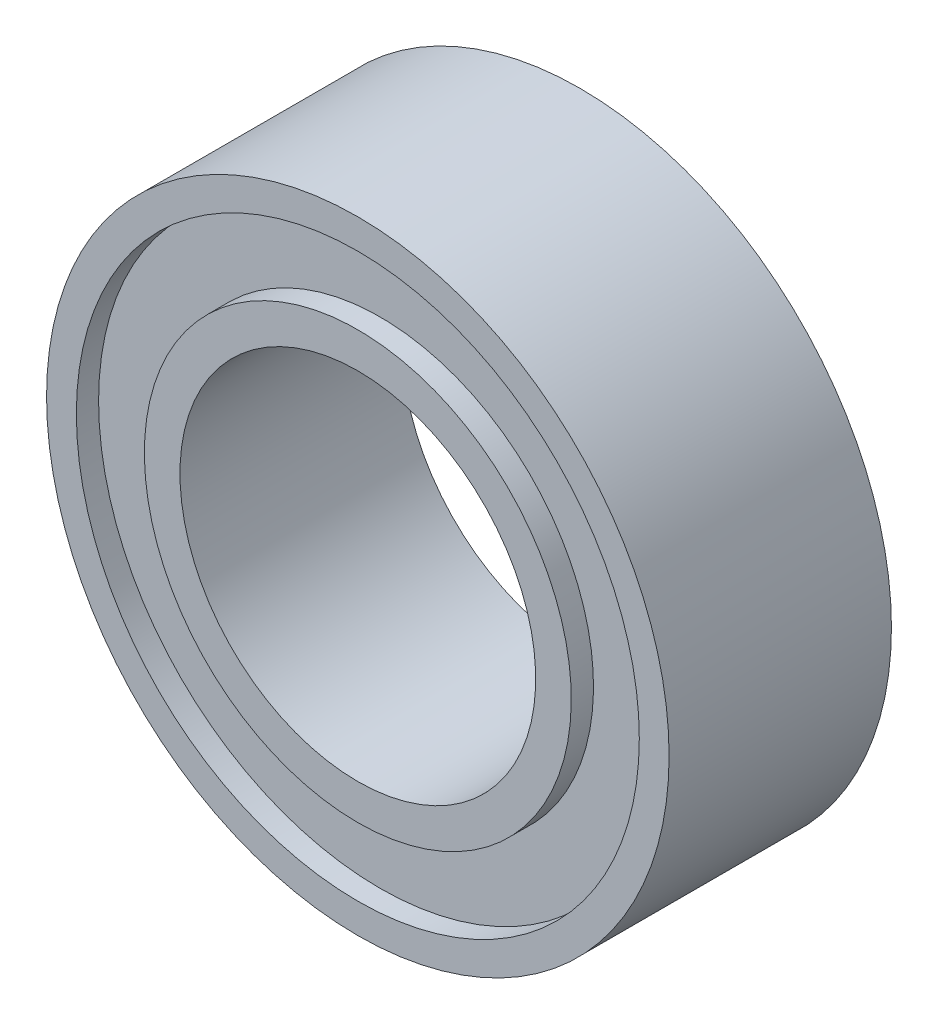
ISO-10303-21;
HEADER;
FILE_DESCRIPTION(('STEP AP214'),'2;1');
FILE_NAME('part.step','',(''),(''),'','','');
FILE_SCHEMA(('AUTOMOTIVE_DESIGN { 1 0 10303 214 1 1 1 1 }'));
ENDSEC;
DATA;
#1=APPLICATION_CONTEXT('core data for automotive mechanical design processes');
#2=APPLICATION_PROTOCOL_DEFINITION('international standard','automotive_design',2000,#1);
#3=PRODUCT_CONTEXT('',#1,'mechanical');
#4=PRODUCT('Part','Part','',(#3));
#5=PRODUCT_RELATED_PRODUCT_CATEGORY('part','',(#4));
#6=PRODUCT_DEFINITION_FORMATION('','',#4);
#7=PRODUCT_DEFINITION_CONTEXT('part definition',#1,'design');
#8=PRODUCT_DEFINITION('design','',#6,#7);
#9=PRODUCT_DEFINITION_SHAPE('','',#8);
#10=(LENGTH_UNIT() NAMED_UNIT(*) SI_UNIT(.MILLI.,.METRE.));
#11=(NAMED_UNIT(*) PLANE_ANGLE_UNIT() SI_UNIT($,.RADIAN.));
#12=(NAMED_UNIT(*) SI_UNIT($,.STERADIAN.) SOLID_ANGLE_UNIT());
#13=UNCERTAINTY_MEASURE_WITH_UNIT(LENGTH_MEASURE(1.E-05),#10,'distance_accuracy_value','');
#14=(GEOMETRIC_REPRESENTATION_CONTEXT(3) GLOBAL_UNCERTAINTY_ASSIGNED_CONTEXT((#13)) GLOBAL_UNIT_ASSIGNED_CONTEXT((#10,
#11,#12)) REPRESENTATION_CONTEXT('',''));
#15=CARTESIAN_POINT('',(0.,0.,0.));
#16=DIRECTION('',(0.,0.,1.));
#17=DIRECTION('',(1.,0.,0.));
#18=AXIS2_PLACEMENT_3D('',#15,#16,#17);
#19=CARTESIAN_POINT('',(0.,3.5,1.25));
#20=DIRECTION('',(0.,0.,-1.));
#21=DIRECTION('',(0.,1.,0.));
#22=AXIS2_PLACEMENT_3D('',#19,#20,#21);
#23=PLANE('',#22);
#24=CARTESIAN_POINT('',(0.,0.,1.25));
#25=DIRECTION('',(0.,0.,1.));
#26=DIRECTION('',(0.,-1.,0.));
#27=AXIS2_PLACEMENT_3D('',#24,#25,#26);
#28=CIRCLE('',#27,3.165);
#29=CARTESIAN_POINT('',(0.,-3.165,1.25));
#30=VERTEX_POINT('',#29);
#31=EDGE_CURVE('E10',#30,#30,#28,.T.);
#32=ORIENTED_EDGE('',*,*,#31,.F.);
#33=EDGE_LOOP('',(#32));
#34=FACE_BOUND('',#33,.T.);
#35=CARTESIAN_POINT('',(0.,0.,1.25));
#36=DIRECTION('',(0.,0.,1.));
#37=DIRECTION('',(0.,-1.,0.));
#38=AXIS2_PLACEMENT_3D('',#35,#36,#37);
#39=CIRCLE('',#38,3.5);
#40=CARTESIAN_POINT('',(0.,-3.5,1.25));
#41=VERTEX_POINT('',#40);
#42=EDGE_CURVE('E71',#41,#41,#39,.T.);
#43=ORIENTED_EDGE('',*,*,#42,.T.);
#44=EDGE_LOOP('',(#43));
#45=FACE_BOUND('',#44,.T.);
#46=ADVANCED_FACE('F31',(#34,#45),#23,.F.);
#47=CARTESIAN_POINT('',(0.,0.,1.25));
#48=DIRECTION('',(0.,0.,1.));
#49=DIRECTION('',(0.,-1.,0.));
#50=AXIS2_PLACEMENT_3D('',#47,#48,#49);
#51=CYLINDRICAL_SURFACE('',#50,3.165);
#52=CARTESIAN_POINT('',(0.,0.,0.999999999999999));
#53=DIRECTION('',(0.,0.,1.));
#54=DIRECTION('',(0.,-1.,0.));
#55=AXIS2_PLACEMENT_3D('',#52,#53,#54);
#56=CIRCLE('',#55,3.165);
#57=CARTESIAN_POINT('',(0.,-3.165,0.999999999999999));
#58=VERTEX_POINT('',#57);
#59=EDGE_CURVE('E37',#58,#58,#56,.T.);
#60=ORIENTED_EDGE('',*,*,#59,.F.);
#61=EDGE_LOOP('',(#60));
#62=FACE_BOUND('',#61,.T.);
#63=ORIENTED_EDGE('',*,*,#31,.T.);
#64=EDGE_LOOP('',(#63));
#65=FACE_BOUND('',#64,.T.);
#66=ADVANCED_FACE('F132',(#62,#65),#51,.F.);
#67=CARTESIAN_POINT('',(0.,3.165,1.));
#68=DIRECTION('',(0.,0.,-1.));
#69=DIRECTION('',(0.,1.,0.));
#70=AXIS2_PLACEMENT_3D('',#67,#68,#69);
#71=PLANE('',#70);
#72=CARTESIAN_POINT('',(0.,0.,1.));
#73=DIRECTION('',(0.,0.,1.));
#74=DIRECTION('',(0.,-1.,0.));
#75=AXIS2_PLACEMENT_3D('',#72,#73,#74);
#76=CIRCLE('',#75,2.4);
#77=CARTESIAN_POINT('',(0.,-2.4,0.999999999999999));
#78=VERTEX_POINT('',#77);
#79=EDGE_CURVE('E41',#78,#78,#76,.T.);
#80=ORIENTED_EDGE('',*,*,#79,.F.);
#81=EDGE_LOOP('',(#80));
#82=FACE_BOUND('',#81,.T.);
#83=ORIENTED_EDGE('',*,*,#59,.T.);
#84=EDGE_LOOP('',(#83));
#85=FACE_BOUND('',#84,.T.);
#86=ADVANCED_FACE('F127',(#82,#85),#71,.F.);
#87=CARTESIAN_POINT('',(0.,0.,1.25));
#88=DIRECTION('',(0.,0.,1.));
#89=DIRECTION('',(0.,-1.,0.));
#90=AXIS2_PLACEMENT_3D('',#87,#88,#89);
#91=CYLINDRICAL_SURFACE('',#90,2.4);
#92=CARTESIAN_POINT('',(0.,0.,1.25));
#93=DIRECTION('',(0.,0.,1.));
#94=DIRECTION('',(0.,-1.,0.));
#95=AXIS2_PLACEMENT_3D('',#92,#93,#94);
#96=CIRCLE('',#95,2.4);
#97=CARTESIAN_POINT('',(0.,-2.4,1.25));
#98=VERTEX_POINT('',#97);
#99=EDGE_CURVE('E45',#98,#98,#96,.T.);
#100=ORIENTED_EDGE('',*,*,#99,.F.);
#101=EDGE_LOOP('',(#100));
#102=FACE_BOUND('',#101,.T.);
#103=ORIENTED_EDGE('',*,*,#79,.T.);
#104=EDGE_LOOP('',(#103));
#105=FACE_BOUND('',#104,.T.);
#106=ADVANCED_FACE('F121',(#102,#105),#91,.T.);
#107=CARTESIAN_POINT('',(0.,2.4,1.25));
#108=DIRECTION('',(0.,0.,-1.));
#109=DIRECTION('',(0.,1.,0.));
#110=AXIS2_PLACEMENT_3D('',#107,#108,#109);
#111=PLANE('',#110);
#112=CARTESIAN_POINT('',(0.,0.,1.25));
#113=DIRECTION('',(0.,0.,1.));
#114=DIRECTION('',(0.,-1.,0.));
#115=AXIS2_PLACEMENT_3D('',#112,#113,#114);
#116=CIRCLE('',#115,2.);
#117=CARTESIAN_POINT('',(0.,-2.,1.25));
#118=VERTEX_POINT('',#117);
#119=EDGE_CURVE('E50',#118,#118,#116,.T.);
#120=ORIENTED_EDGE('',*,*,#119,.F.);
#121=EDGE_LOOP('',(#120));
#122=FACE_BOUND('',#121,.T.);
#123=ORIENTED_EDGE('',*,*,#99,.T.);
#124=EDGE_LOOP('',(#123));
#125=FACE_BOUND('',#124,.T.);
#126=ADVANCED_FACE('F115',(#122,#125),#111,.F.);
#127=CARTESIAN_POINT('',(0.,0.,1.25));
#128=DIRECTION('',(0.,0.,1.));
#129=DIRECTION('',(0.,-1.,0.));
#130=AXIS2_PLACEMENT_3D('',#127,#128,#129);
#131=CYLINDRICAL_SURFACE('',#130,2.);
#132=CARTESIAN_POINT('',(0.,0.,-1.25));
#133=DIRECTION('',(0.,0.,1.));
#134=DIRECTION('',(0.,-1.,0.));
#135=AXIS2_PLACEMENT_3D('',#132,#133,#134);
#136=CIRCLE('',#135,2.);
#137=CARTESIAN_POINT('',(0.,-2.,-1.25));
#138=VERTEX_POINT('',#137);
#139=EDGE_CURVE('E53',#138,#138,#136,.T.);
#140=ORIENTED_EDGE('',*,*,#139,.F.);
#141=EDGE_LOOP('',(#140));
#142=FACE_BOUND('',#141,.T.);
#143=ORIENTED_EDGE('',*,*,#119,.T.);
#144=EDGE_LOOP('',(#143));
#145=FACE_BOUND('',#144,.T.);
#146=ADVANCED_FACE('F109',(#142,#145),#131,.F.);
#147=CARTESIAN_POINT('',(0.,2.4,-1.25));
#148=DIRECTION('',(0.,0.,1.));
#149=DIRECTION('',(0.,-1.,0.));
#150=AXIS2_PLACEMENT_3D('',#147,#148,#149);
#151=PLANE('',#150);
#152=CARTESIAN_POINT('',(0.,0.,-1.25));
#153=DIRECTION('',(0.,0.,1.));
#154=DIRECTION('',(0.,-1.,0.));
#155=AXIS2_PLACEMENT_3D('',#152,#153,#154);
#156=CIRCLE('',#155,2.4);
#157=CARTESIAN_POINT('',(0.,-2.4,-1.25));
#158=VERTEX_POINT('',#157);
#159=EDGE_CURVE('E56',#158,#158,#156,.T.);
#160=ORIENTED_EDGE('',*,*,#159,.F.);
#161=EDGE_LOOP('',(#160));
#162=FACE_BOUND('',#161,.T.);
#163=ORIENTED_EDGE('',*,*,#139,.T.);
#164=EDGE_LOOP('',(#163));
#165=FACE_BOUND('',#164,.T.);
#166=ADVANCED_FACE('F103',(#162,#165),#151,.F.);
#167=CARTESIAN_POINT('',(0.,0.,1.25));
#168=DIRECTION('',(0.,0.,1.));
#169=DIRECTION('',(0.,-1.,0.));
#170=AXIS2_PLACEMENT_3D('',#167,#168,#169);
#171=CYLINDRICAL_SURFACE('',#170,2.4);
#172=CARTESIAN_POINT('',(0.,0.,-1.));
#173=DIRECTION('',(0.,0.,1.));
#174=DIRECTION('',(0.,-1.,0.));
#175=AXIS2_PLACEMENT_3D('',#172,#173,#174);
#176=CIRCLE('',#175,2.4);
#177=CARTESIAN_POINT('',(0.,-2.4,-1.));
#178=VERTEX_POINT('',#177);
#179=EDGE_CURVE('E59',#178,#178,#176,.T.);
#180=ORIENTED_EDGE('',*,*,#179,.F.);
#181=EDGE_LOOP('',(#180));
#182=FACE_BOUND('',#181,.T.);
#183=ORIENTED_EDGE('',*,*,#159,.T.);
#184=EDGE_LOOP('',(#183));
#185=FACE_BOUND('',#184,.T.);
#186=ADVANCED_FACE('F97',(#182,#185),#171,.T.);
#187=CARTESIAN_POINT('',(0.,3.165,-1.));
#188=DIRECTION('',(0.,0.,1.));
#189=DIRECTION('',(0.,-1.,0.));
#190=AXIS2_PLACEMENT_3D('',#187,#188,#189);
#191=PLANE('',#190);
#192=CARTESIAN_POINT('',(0.,0.,-1.));
#193=DIRECTION('',(0.,0.,1.));
#194=DIRECTION('',(0.,-1.,0.));
#195=AXIS2_PLACEMENT_3D('',#192,#193,#194);
#196=CIRCLE('',#195,3.165);
#197=CARTESIAN_POINT('',(0.,-3.165,-1.));
#198=VERTEX_POINT('',#197);
#199=EDGE_CURVE('E62',#198,#198,#196,.T.);
#200=ORIENTED_EDGE('',*,*,#199,.F.);
#201=EDGE_LOOP('',(#200));
#202=FACE_BOUND('',#201,.T.);
#203=ORIENTED_EDGE('',*,*,#179,.T.);
#204=EDGE_LOOP('',(#203));
#205=FACE_BOUND('',#204,.T.);
#206=ADVANCED_FACE('F91',(#202,#205),#191,.F.);
#207=CARTESIAN_POINT('',(0.,0.,1.25));
#208=DIRECTION('',(0.,0.,1.));
#209=DIRECTION('',(0.,-1.,0.));
#210=AXIS2_PLACEMENT_3D('',#207,#208,#209);
#211=CYLINDRICAL_SURFACE('',#210,3.165);
#212=CARTESIAN_POINT('',(0.,0.,-1.25));
#213=DIRECTION('',(0.,0.,1.));
#214=DIRECTION('',(0.,-1.,0.));
#215=AXIS2_PLACEMENT_3D('',#212,#213,#214);
#216=CIRCLE('',#215,3.165);
#217=CARTESIAN_POINT('',(0.,-3.165,-1.25));
#218=VERTEX_POINT('',#217);
#219=EDGE_CURVE('E65',#218,#218,#216,.T.);
#220=ORIENTED_EDGE('',*,*,#219,.F.);
#221=EDGE_LOOP('',(#220));
#222=FACE_BOUND('',#221,.T.);
#223=ORIENTED_EDGE('',*,*,#199,.T.);
#224=EDGE_LOOP('',(#223));
#225=FACE_BOUND('',#224,.T.);
#226=ADVANCED_FACE('F85',(#222,#225),#211,.F.);
#227=CARTESIAN_POINT('',(0.,3.5,-1.25));
#228=DIRECTION('',(0.,0.,1.));
#229=DIRECTION('',(0.,-1.,0.));
#230=AXIS2_PLACEMENT_3D('',#227,#228,#229);
#231=PLANE('',#230);
#232=CARTESIAN_POINT('',(0.,0.,-1.25));
#233=DIRECTION('',(0.,0.,1.));
#234=DIRECTION('',(0.,-1.,0.));
#235=AXIS2_PLACEMENT_3D('',#232,#233,#234);
#236=CIRCLE('',#235,3.5);
#237=CARTESIAN_POINT('',(0.,-3.5,-1.25));
#238=VERTEX_POINT('',#237);
#239=EDGE_CURVE('E68',#238,#238,#236,.T.);
#240=ORIENTED_EDGE('',*,*,#239,.F.);
#241=EDGE_LOOP('',(#240));
#242=FACE_BOUND('',#241,.T.);
#243=ORIENTED_EDGE('',*,*,#219,.T.);
#244=EDGE_LOOP('',(#243));
#245=FACE_BOUND('',#244,.T.);
#246=ADVANCED_FACE('F79',(#242,#245),#231,.F.);
#247=CARTESIAN_POINT('',(0.,0.,1.25));
#248=DIRECTION('',(0.,0.,1.));
#249=DIRECTION('',(0.,-1.,0.));
#250=AXIS2_PLACEMENT_3D('',#247,#248,#249);
#251=CYLINDRICAL_SURFACE('',#250,3.5);
#252=ORIENTED_EDGE('',*,*,#42,.F.);
#253=EDGE_LOOP('',(#252));
#254=FACE_BOUND('',#253,.T.);
#255=ORIENTED_EDGE('',*,*,#239,.T.);
#256=EDGE_LOOP('',(#255));
#257=FACE_BOUND('',#256,.T.);
#258=ADVANCED_FACE('F76',(#254,#257),#251,.T.);
#259=CLOSED_SHELL('',(#46,#66,#86,#106,#126,#146,#166,#186,#206,#226,#246,#258));
#260=MANIFOLD_SOLID_BREP('B2',#259);
#261=ADVANCED_BREP_SHAPE_REPRESENTATION('',(#18,#260),#14);
#262=SHAPE_DEFINITION_REPRESENTATION(#9,#261);
ENDSEC;
END-ISO-10303-21;
